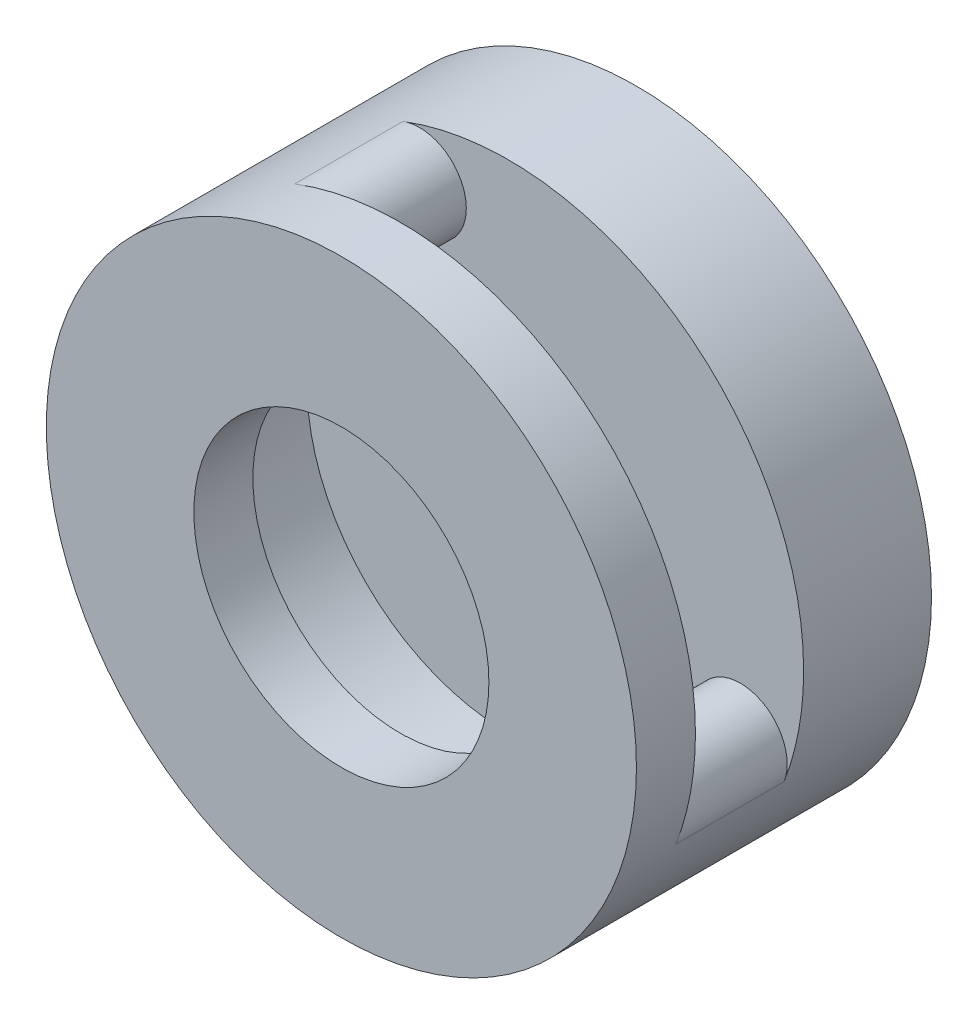
ISO-10303-21;
HEADER;
FILE_DESCRIPTION(('STEP AP214'),'2;1');
FILE_NAME('part.step','',(''),(''),'','','');
FILE_SCHEMA(('AUTOMOTIVE_DESIGN { 1 0 10303 214 1 1 1 1 }'));
ENDSEC;
DATA;
#1=APPLICATION_CONTEXT('core data for automotive mechanical design processes');
#2=APPLICATION_PROTOCOL_DEFINITION('international standard','automotive_design',2000,#1);
#3=PRODUCT_CONTEXT('',#1,'mechanical');
#4=PRODUCT('Part','Part','',(#3));
#5=PRODUCT_RELATED_PRODUCT_CATEGORY('part','',(#4));
#6=PRODUCT_DEFINITION_FORMATION('','',#4);
#7=PRODUCT_DEFINITION_CONTEXT('part definition',#1,'design');
#8=PRODUCT_DEFINITION('design','',#6,#7);
#9=PRODUCT_DEFINITION_SHAPE('','',#8);
#10=(LENGTH_UNIT() NAMED_UNIT(*) SI_UNIT(.MILLI.,.METRE.));
#11=(NAMED_UNIT(*) PLANE_ANGLE_UNIT() SI_UNIT($,.RADIAN.));
#12=(NAMED_UNIT(*) SI_UNIT($,.STERADIAN.) SOLID_ANGLE_UNIT());
#13=UNCERTAINTY_MEASURE_WITH_UNIT(LENGTH_MEASURE(1.E-05),#10,'distance_accuracy_value','');
#14=(GEOMETRIC_REPRESENTATION_CONTEXT(3) GLOBAL_UNCERTAINTY_ASSIGNED_CONTEXT((#13)) GLOBAL_UNIT_ASSIGNED_CONTEXT((#10,
#11,#12)) REPRESENTATION_CONTEXT('',''));
#15=CARTESIAN_POINT('',(0.,0.,0.));
#16=DIRECTION('',(0.,0.,1.));
#17=DIRECTION('',(1.,0.,0.));
#18=AXIS2_PLACEMENT_3D('',#15,#16,#17);
#19=CARTESIAN_POINT('',(0.,0.,3.));
#20=DIRECTION('',(0.,0.,-1.));
#21=DIRECTION('',(-1.,0.,0.));
#22=AXIS2_PLACEMENT_3D('',#19,#20,#21);
#23=CYLINDRICAL_SURFACE('',#22,3.);
#24=CARTESIAN_POINT('',(0.,0.,0.));
#25=DIRECTION('',(0.,0.,1.));
#26=DIRECTION('',(1.,0.,0.));
#27=AXIS2_PLACEMENT_3D('',#24,#25,#26);
#28=CIRCLE('',#27,3.);
#29=CARTESIAN_POINT('',(3.,0.,0.));
#30=VERTEX_POINT('',#29);
#31=EDGE_CURVE('E130',#30,#30,#28,.T.);
#32=ORIENTED_EDGE('',*,*,#31,.T.);
#33=EDGE_LOOP('',(#32));
#34=FACE_BOUND('',#33,.T.);
#35=CARTESIAN_POINT('',(0.,0.,3.));
#36=DIRECTION('',(0.,0.,1.));
#37=DIRECTION('',(1.,0.,0.));
#38=AXIS2_PLACEMENT_3D('',#35,#36,#37);
#39=CIRCLE('',#38,3.);
#40=CARTESIAN_POINT('',(3.,0.,3.));
#41=VERTEX_POINT('',#40);
#42=EDGE_CURVE('E131',#41,#41,#39,.T.);
#43=ORIENTED_EDGE('',*,*,#42,.F.);
#44=EDGE_LOOP('',(#43));
#45=FACE_BOUND('',#44,.T.);
#46=CARTESIAN_POINT('',(0.,0.,1.3));
#47=DIRECTION('',(0.,0.,1.));
#48=DIRECTION('',(1.,0.,0.));
#49=AXIS2_PLACEMENT_3D('',#46,#47,#48);
#50=CIRCLE('',#49,3.);
#51=CARTESIAN_POINT('',(2.80074127949162,-1.07510384863588,1.3));
#52=VERTEX_POINT('',#51);
#53=CARTESIAN_POINT('',(-1.07510384863589,2.80074127949161,1.3));
#54=VERTEX_POINT('',#53);
#55=EDGE_CURVE('E11',#52,#54,#50,.T.);
#56=ORIENTED_EDGE('',*,*,#55,.F.);
#57=DIRECTION('',(0.,0.,1.));
#58=VECTOR('',#57,1.);
#59=CARTESIAN_POINT('',(2.80074127949162,-1.07510384863588,1.3));
#60=LINE('',#59,#58);
#61=CARTESIAN_POINT('',(2.80074127949162,-1.07510384863588,2.4));
#62=VERTEX_POINT('',#61);
#63=EDGE_CURVE('E94',#52,#62,#60,.T.);
#64=ORIENTED_EDGE('',*,*,#63,.T.);
#65=CARTESIAN_POINT('',(0.,0.,2.4));
#66=DIRECTION('',(0.,0.,1.));
#67=DIRECTION('',(1.,0.,0.));
#68=AXIS2_PLACEMENT_3D('',#65,#66,#67);
#69=CIRCLE('',#68,3.);
#70=CARTESIAN_POINT('',(-1.07510384863589,2.80074127949161,2.4));
#71=VERTEX_POINT('',#70);
#72=EDGE_CURVE('E47',#62,#71,#69,.T.);
#73=ORIENTED_EDGE('',*,*,#72,.T.);
#74=DIRECTION('',(0.,0.,1.));
#75=VECTOR('',#74,1.);
#76=CARTESIAN_POINT('',(-1.07510384863589,2.80074127949161,1.3));
#77=LINE('',#76,#75);
#78=EDGE_CURVE('E115',#54,#71,#77,.T.);
#79=ORIENTED_EDGE('',*,*,#78,.F.);
#80=EDGE_LOOP('',(#56,#64,#73,#79));
#81=FACE_BOUND('',#80,.T.);
#82=ADVANCED_FACE('F39',(#34,#45,#81),#23,.T.);
#83=CARTESIAN_POINT('',(0.,0.,3.));
#84=DIRECTION('',(0.,0.,1.));
#85=DIRECTION('',(1.,0.,0.));
#86=AXIS2_PLACEMENT_3D('',#83,#84,#85);
#87=PLANE('',#86);
#88=CARTESIAN_POINT('',(0.,0.,3.));
#89=DIRECTION('',(0.,0.,1.));
#90=DIRECTION('',(1.,0.,0.));
#91=AXIS2_PLACEMENT_3D('',#88,#89,#90);
#92=CIRCLE('',#91,1.5);
#93=CARTESIAN_POINT('',(1.5,0.,3.));
#94=VERTEX_POINT('',#93);
#95=EDGE_CURVE('E126',#94,#94,#92,.T.);
#96=ORIENTED_EDGE('',*,*,#95,.F.);
#97=EDGE_LOOP('',(#96));
#98=FACE_BOUND('',#97,.T.);
#99=ORIENTED_EDGE('',*,*,#42,.T.);
#100=EDGE_LOOP('',(#99));
#101=FACE_BOUND('',#100,.T.);
#102=ADVANCED_FACE('F154',(#98,#101),#87,.T.);
#103=CARTESIAN_POINT('',(0.,0.,0.));
#104=DIRECTION('',(0.,0.,1.));
#105=DIRECTION('',(1.,0.,0.));
#106=AXIS2_PLACEMENT_3D('',#103,#104,#105);
#107=PLANE('',#106);
#108=ORIENTED_EDGE('',*,*,#31,.F.);
#109=EDGE_LOOP('',(#108));
#110=FACE_BOUND('',#109,.T.);
#111=ADVANCED_FACE('F159',(#110),#107,.F.);
#112=CARTESIAN_POINT('',(0.,0.,2.4));
#113=DIRECTION('',(0.,0.,1.));
#114=DIRECTION('',(1.,0.,0.));
#115=AXIS2_PLACEMENT_3D('',#112,#113,#114);
#116=CYLINDRICAL_SURFACE('',#115,1.5);
#117=CARTESIAN_POINT('',(0.,0.,2.4));
#118=DIRECTION('',(0.,0.,1.));
#119=DIRECTION('',(1.,0.,0.));
#120=AXIS2_PLACEMENT_3D('',#117,#118,#119);
#121=CIRCLE('',#120,1.5);
#122=CARTESIAN_POINT('',(1.5,0.,2.4));
#123=VERTEX_POINT('',#122);
#124=EDGE_CURVE('E118',#123,#123,#121,.T.);
#125=ORIENTED_EDGE('',*,*,#124,.F.);
#126=EDGE_LOOP('',(#125));
#127=FACE_BOUND('',#126,.T.);
#128=ORIENTED_EDGE('',*,*,#95,.T.);
#129=EDGE_LOOP('',(#128));
#130=FACE_BOUND('',#129,.T.);
#131=ADVANCED_FACE('F168',(#127,#130),#116,.F.);
#132=CARTESIAN_POINT('',(-0.904879072601873,2.35729057690544,1.3));
#133=DIRECTION('',(0.,0.,1.));
#134=DIRECTION('',(1.,0.,0.));
#135=AXIS2_PLACEMENT_3D('',#132,#133,#134);
#136=PLANE('',#135);
#137=ORIENTED_EDGE('',*,*,#55,.T.);
#138=CARTESIAN_POINT('',(-0.904879072601873,2.35729057690544,1.3));
#139=DIRECTION('',(0.,0.,-1.));
#140=DIRECTION('',(1.,0.,0.));
#141=AXIS2_PLACEMENT_3D('',#138,#139,#140);
#142=CIRCLE('',#141,0.475000000000001);
#143=CARTESIAN_POINT('',(-0.734654296567857,1.91383987431927,1.3));
#144=VERTEX_POINT('',#143);
#145=EDGE_CURVE('E102',#54,#144,#142,.T.);
#146=ORIENTED_EDGE('',*,*,#145,.T.);
#147=CARTESIAN_POINT('',(0.,0.,1.3));
#148=DIRECTION('',(0.,0.,1.));
#149=DIRECTION('',(1.,0.,0.));
#150=AXIS2_PLACEMENT_3D('',#147,#148,#149);
#151=CIRCLE('',#150,2.05);
#152=CARTESIAN_POINT('',(1.91383987431927,-0.734654296567849,1.3));
#153=VERTEX_POINT('',#152);
#154=EDGE_CURVE('E90',#144,#153,#151,.T.);
#155=ORIENTED_EDGE('',*,*,#154,.T.);
#156=CARTESIAN_POINT('',(2.35729057690544,-0.904879072601863,1.3));
#157=DIRECTION('',(0.,0.,-1.));
#158=DIRECTION('',(-1.,0.,0.));
#159=AXIS2_PLACEMENT_3D('',#156,#157,#158);
#160=CIRCLE('',#159,0.475000000000001);
#161=EDGE_CURVE('E96',#153,#52,#160,.T.);
#162=ORIENTED_EDGE('',*,*,#161,.T.);
#163=EDGE_LOOP('',(#137,#146,#155,#162));
#164=FACE_BOUND('',#163,.T.);
#165=ADVANCED_FACE('F101',(#164),#136,.T.);
#166=CARTESIAN_POINT('',(-0.904879072601873,2.35729057690544,2.4));
#167=DIRECTION('',(0.,0.,1.));
#168=DIRECTION('',(1.,0.,0.));
#169=AXIS2_PLACEMENT_3D('',#166,#167,#168);
#170=PLANE('',#169);
#171=ORIENTED_EDGE('',*,*,#124,.T.);
#172=EDGE_LOOP('',(#171));
#173=FACE_BOUND('',#172,.T.);
#174=CARTESIAN_POINT('',(2.35729057690544,-0.904879072601863,2.4));
#175=DIRECTION('',(0.,0.,-1.));
#176=DIRECTION('',(-1.,0.,0.));
#177=AXIS2_PLACEMENT_3D('',#174,#175,#176);
#178=CIRCLE('',#177,0.475000000000001);
#179=CARTESIAN_POINT('',(1.91383987431927,-0.734654296567849,2.4));
#180=VERTEX_POINT('',#179);
#181=EDGE_CURVE('E106',#180,#62,#178,.T.);
#182=ORIENTED_EDGE('',*,*,#181,.F.);
#183=CARTESIAN_POINT('',(0.,0.,2.4));
#184=DIRECTION('',(0.,0.,1.));
#185=DIRECTION('',(1.,0.,0.));
#186=AXIS2_PLACEMENT_3D('',#183,#184,#185);
#187=CIRCLE('',#186,2.05);
#188=CARTESIAN_POINT('',(-0.734654296567857,1.91383987431927,2.4));
#189=VERTEX_POINT('',#188);
#190=EDGE_CURVE('E91',#189,#180,#187,.T.);
#191=ORIENTED_EDGE('',*,*,#190,.F.);
#192=CARTESIAN_POINT('',(-0.904879072601873,2.35729057690544,2.4));
#193=DIRECTION('',(0.,0.,-1.));
#194=DIRECTION('',(1.,0.,0.));
#195=AXIS2_PLACEMENT_3D('',#192,#193,#194);
#196=CIRCLE('',#195,0.475000000000001);
#197=EDGE_CURVE('E54',#71,#189,#196,.T.);
#198=ORIENTED_EDGE('',*,*,#197,.F.);
#199=ORIENTED_EDGE('',*,*,#72,.F.);
#200=EDGE_LOOP('',(#182,#191,#198,#199));
#201=FACE_BOUND('',#200,.T.);
#202=ADVANCED_FACE('F142',(#173,#201),#170,.F.);
#203=CARTESIAN_POINT('',(-0.904879072601873,2.35729057690544,1.3));
#204=DIRECTION('',(0.,0.,1.));
#205=DIRECTION('',(1.,0.,0.));
#206=AXIS2_PLACEMENT_3D('',#203,#204,#205);
#207=CYLINDRICAL_SURFACE('',#206,0.475000000000001);
#208=ORIENTED_EDGE('',*,*,#197,.T.);
#209=DIRECTION('',(0.,0.,1.));
#210=VECTOR('',#209,1.);
#211=CARTESIAN_POINT('',(-0.734654296567857,1.91383987431927,1.3));
#212=LINE('',#211,#210);
#213=EDGE_CURVE('E81',#144,#189,#212,.T.);
#214=ORIENTED_EDGE('',*,*,#213,.F.);
#215=ORIENTED_EDGE('',*,*,#145,.F.);
#216=ORIENTED_EDGE('',*,*,#78,.T.);
#217=EDGE_LOOP('',(#208,#214,#215,#216));
#218=FACE_BOUND('',#217,.T.);
#219=ADVANCED_FACE('F140',(#218),#207,.T.);
#220=CARTESIAN_POINT('',(2.35729057690544,-0.904879072601863,1.3));
#221=DIRECTION('',(0.,0.,1.));
#222=DIRECTION('',(1.,0.,0.));
#223=AXIS2_PLACEMENT_3D('',#220,#221,#222);
#224=CYLINDRICAL_SURFACE('',#223,0.475000000000001);
#225=ORIENTED_EDGE('',*,*,#181,.T.);
#226=ORIENTED_EDGE('',*,*,#63,.F.);
#227=ORIENTED_EDGE('',*,*,#161,.F.);
#228=DIRECTION('',(0.,0.,1.));
#229=VECTOR('',#228,1.);
#230=CARTESIAN_POINT('',(1.91383987431927,-0.734654296567849,1.3));
#231=LINE('',#230,#229);
#232=EDGE_CURVE('E86',#153,#180,#231,.T.);
#233=ORIENTED_EDGE('',*,*,#232,.T.);
#234=EDGE_LOOP('',(#225,#226,#227,#233));
#235=FACE_BOUND('',#234,.T.);
#236=ADVANCED_FACE('F97',(#235),#224,.T.);
#237=CARTESIAN_POINT('',(0.,0.,1.3));
#238=DIRECTION('',(0.,0.,1.));
#239=DIRECTION('',(1.,0.,0.));
#240=AXIS2_PLACEMENT_3D('',#237,#238,#239);
#241=CYLINDRICAL_SURFACE('',#240,2.05);
#242=ORIENTED_EDGE('',*,*,#190,.T.);
#243=ORIENTED_EDGE('',*,*,#232,.F.);
#244=ORIENTED_EDGE('',*,*,#154,.F.);
#245=ORIENTED_EDGE('',*,*,#213,.T.);
#246=EDGE_LOOP('',(#242,#243,#244,#245));
#247=FACE_BOUND('',#246,.T.);
#248=ADVANCED_FACE('F88',(#247),#241,.F.);
#249=CLOSED_SHELL('',(#82,#102,#111,#131,#165,#202,#219,#236,#248));
#250=MANIFOLD_SOLID_BREP('B2',#249);
#251=ADVANCED_BREP_SHAPE_REPRESENTATION('',(#18,#250),#14);
#252=SHAPE_DEFINITION_REPRESENTATION(#9,#251);
ENDSEC;
END-ISO-10303-21;
